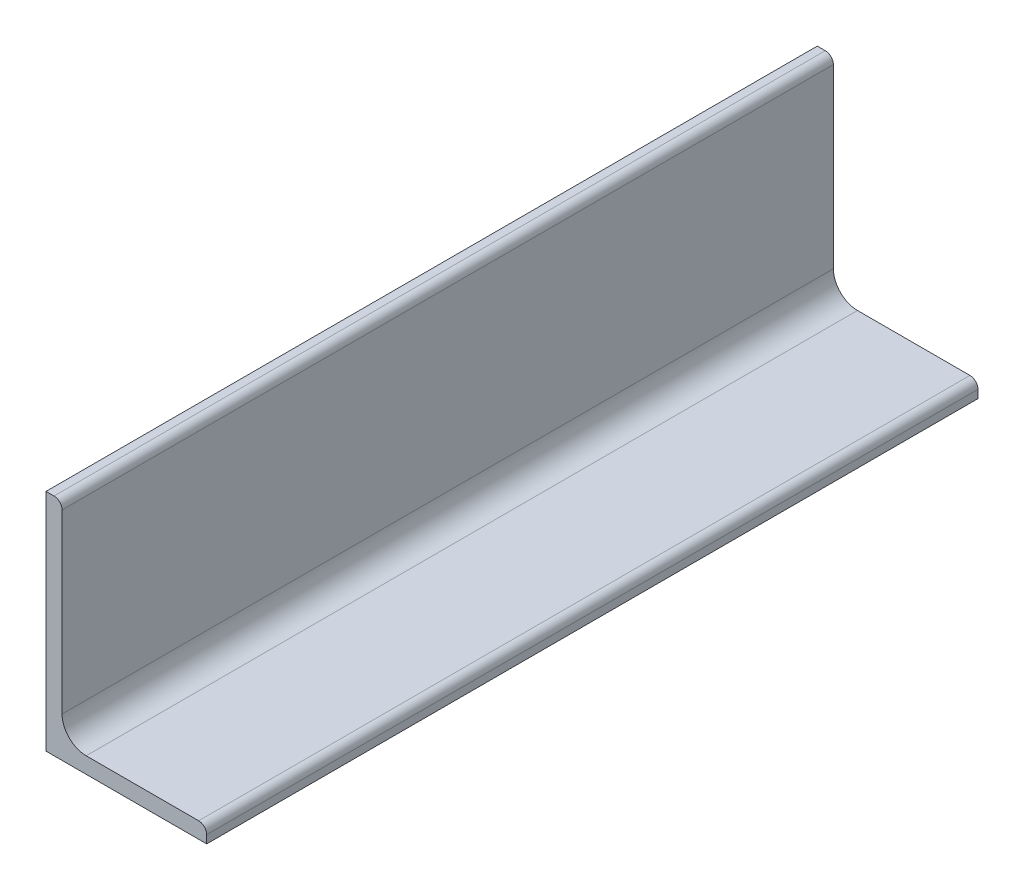
ISO-10303-21;
HEADER;
FILE_DESCRIPTION(('STEP AP214'),'2;1');
FILE_NAME('part.step','',(''),(''),'','','');
FILE_SCHEMA(('AUTOMOTIVE_DESIGN { 1 0 10303 214 1 1 1 1 }'));
ENDSEC;
DATA;
#1=APPLICATION_CONTEXT('core data for automotive mechanical design processes');
#2=APPLICATION_PROTOCOL_DEFINITION('international standard','automotive_design',2000,#1);
#3=PRODUCT_CONTEXT('',#1,'mechanical');
#4=PRODUCT('Part','Part','',(#3));
#5=PRODUCT_RELATED_PRODUCT_CATEGORY('part','',(#4));
#6=PRODUCT_DEFINITION_FORMATION('','',#4);
#7=PRODUCT_DEFINITION_CONTEXT('part definition',#1,'design');
#8=PRODUCT_DEFINITION('design','',#6,#7);
#9=PRODUCT_DEFINITION_SHAPE('','',#8);
#10=(LENGTH_UNIT() NAMED_UNIT(*) SI_UNIT(.MILLI.,.METRE.));
#11=(NAMED_UNIT(*) PLANE_ANGLE_UNIT() SI_UNIT($,.RADIAN.));
#12=(NAMED_UNIT(*) SI_UNIT($,.STERADIAN.) SOLID_ANGLE_UNIT());
#13=UNCERTAINTY_MEASURE_WITH_UNIT(LENGTH_MEASURE(1.E-05),#10,'distance_accuracy_value','');
#14=(GEOMETRIC_REPRESENTATION_CONTEXT(3) GLOBAL_UNCERTAINTY_ASSIGNED_CONTEXT((#13)) GLOBAL_UNIT_ASSIGNED_CONTEXT((#10,
#11,#12)) REPRESENTATION_CONTEXT('',''));
#15=CARTESIAN_POINT('',(0.,0.,0.));
#16=DIRECTION('',(0.,0.,1.));
#17=DIRECTION('',(1.,0.,0.));
#18=AXIS2_PLACEMENT_3D('',#15,#16,#17);
#19=CARTESIAN_POINT('',(0.897927251325018,89.7372005393545,304.8));
#20=DIRECTION('',(1.,0.,0.));
#21=DIRECTION('',(0.,0.,-1.));
#22=AXIS2_PLACEMENT_3D('',#19,#20,#21);
#23=PLANE('',#22);
#24=DIRECTION('',(0.,-1.,0.));
#25=VECTOR('',#24,1.);
#26=CARTESIAN_POINT('',(0.897927251325018,89.7372005393545,0.));
#27=LINE('',#26,#25);
#28=CARTESIAN_POINT('',(0.897927251325018,89.7372005393545,0.));
#29=VERTEX_POINT('',#28);
#30=CARTESIAN_POINT('',(0.897927251325018,0.837200539354535,0.));
#31=VERTEX_POINT('',#30);
#32=EDGE_CURVE('E135',#29,#31,#27,.T.);
#33=ORIENTED_EDGE('',*,*,#32,.T.);
#34=DIRECTION('',(0.,0.,-1.));
#35=VECTOR('',#34,1.);
#36=CARTESIAN_POINT('',(0.897927251325018,0.837200539354535,304.8));
#37=LINE('',#36,#35);
#38=CARTESIAN_POINT('',(0.897927251325018,0.837200539354535,304.8));
#39=VERTEX_POINT('',#38);
#40=EDGE_CURVE('E11',#39,#31,#37,.T.);
#41=ORIENTED_EDGE('',*,*,#40,.F.);
#42=DIRECTION('',(0.,-1.,0.));
#43=VECTOR('',#42,1.);
#44=CARTESIAN_POINT('',(0.897927251325018,89.7372005393545,304.8));
#45=LINE('',#44,#43);
#46=CARTESIAN_POINT('',(0.897927251325018,89.7372005393545,304.8));
#47=VERTEX_POINT('',#46);
#48=EDGE_CURVE('E151',#47,#39,#45,.T.);
#49=ORIENTED_EDGE('',*,*,#48,.F.);
#50=DIRECTION('',(0.,0.,-1.));
#51=VECTOR('',#50,1.);
#52=CARTESIAN_POINT('',(0.897927251325018,89.7372005393545,304.8));
#53=LINE('',#52,#51);
#54=EDGE_CURVE('E131',#47,#29,#53,.T.);
#55=ORIENTED_EDGE('',*,*,#54,.T.);
#56=EDGE_LOOP('',(#33,#41,#49,#55));
#57=FACE_BOUND('',#56,.T.);
#58=ADVANCED_FACE('F33',(#57),#23,.F.);
#59=CARTESIAN_POINT('',(0.897927251325018,0.837200539354535,304.8));
#60=DIRECTION('',(0.,1.,0.));
#61=DIRECTION('',(0.,0.,1.));
#62=AXIS2_PLACEMENT_3D('',#59,#60,#61);
#63=PLANE('',#62);
#64=DIRECTION('',(1.,0.,0.));
#65=VECTOR('',#64,1.);
#66=CARTESIAN_POINT('',(0.897927251325018,0.837200539354535,0.));
#67=LINE('',#66,#65);
#68=CARTESIAN_POINT('',(64.397927251325,0.837200539354535,0.));
#69=VERTEX_POINT('',#68);
#70=EDGE_CURVE('E138',#31,#69,#67,.T.);
#71=ORIENTED_EDGE('',*,*,#70,.T.);
#72=DIRECTION('',(0.,0.,-1.));
#73=VECTOR('',#72,1.);
#74=CARTESIAN_POINT('',(64.397927251325,0.837200539354535,304.8));
#75=LINE('',#74,#73);
#76=CARTESIAN_POINT('',(64.397927251325,0.837200539354535,304.8));
#77=VERTEX_POINT('',#76);
#78=EDGE_CURVE('E41',#77,#69,#75,.T.);
#79=ORIENTED_EDGE('',*,*,#78,.F.);
#80=DIRECTION('',(1.,0.,0.));
#81=VECTOR('',#80,1.);
#82=CARTESIAN_POINT('',(0.897927251325018,0.837200539354535,304.8));
#83=LINE('',#82,#81);
#84=EDGE_CURVE('E95',#39,#77,#83,.T.);
#85=ORIENTED_EDGE('',*,*,#84,.F.);
#86=ORIENTED_EDGE('',*,*,#40,.T.);
#87=EDGE_LOOP('',(#71,#79,#85,#86));
#88=FACE_BOUND('',#87,.T.);
#89=ADVANCED_FACE('F194',(#88),#63,.F.);
#90=CARTESIAN_POINT('',(64.397927251325,0.837200539354535,304.8));
#91=DIRECTION('',(-1.,0.,0.));
#92=DIRECTION('',(0.,0.,1.));
#93=AXIS2_PLACEMENT_3D('',#90,#91,#92);
#94=PLANE('',#93);
#95=DIRECTION('',(0.,1.,0.));
#96=VECTOR('',#95,1.);
#97=CARTESIAN_POINT('',(64.397927251325,0.837200539354535,0.));
#98=LINE('',#97,#96);
#99=CARTESIAN_POINT('',(64.397927251325,4.01220053935453,0.));
#100=VERTEX_POINT('',#99);
#101=EDGE_CURVE('E140',#69,#100,#98,.T.);
#102=ORIENTED_EDGE('',*,*,#101,.T.);
#103=DIRECTION('',(0.,0.,-1.));
#104=VECTOR('',#103,1.);
#105=CARTESIAN_POINT('',(64.397927251325,4.01220053935453,304.8));
#106=LINE('',#105,#104);
#107=CARTESIAN_POINT('',(64.397927251325,4.01220053935453,304.8));
#108=VERTEX_POINT('',#107);
#109=EDGE_CURVE('E161',#108,#100,#106,.T.);
#110=ORIENTED_EDGE('',*,*,#109,.F.);
#111=DIRECTION('',(0.,1.,0.));
#112=VECTOR('',#111,1.);
#113=CARTESIAN_POINT('',(64.397927251325,0.837200539354535,304.8));
#114=LINE('',#113,#112);
#115=EDGE_CURVE('E169',#77,#108,#114,.T.);
#116=ORIENTED_EDGE('',*,*,#115,.F.);
#117=ORIENTED_EDGE('',*,*,#78,.T.);
#118=EDGE_LOOP('',(#102,#110,#116,#117));
#119=FACE_BOUND('',#118,.T.);
#120=ADVANCED_FACE('F167',(#119),#94,.F.);
#121=CARTESIAN_POINT('',(61.222927251325,4.01220053935453,304.8));
#122=DIRECTION('',(0.,0.,-1.));
#123=DIRECTION('',(-1.,0.,0.));
#124=AXIS2_PLACEMENT_3D('',#121,#122,#123);
#125=CYLINDRICAL_SURFACE('',#124,3.175);
#126=CARTESIAN_POINT('',(61.222927251325,4.01220053935453,0.));
#127=DIRECTION('',(0.,0.,1.));
#128=DIRECTION('',(1.,0.,0.));
#129=AXIS2_PLACEMENT_3D('',#126,#127,#128);
#130=CIRCLE('',#129,3.175);
#131=CARTESIAN_POINT('',(61.222927251325,7.18720053935453,0.));
#132=VERTEX_POINT('',#131);
#133=EDGE_CURVE('E142',#100,#132,#130,.T.);
#134=ORIENTED_EDGE('',*,*,#133,.T.);
#135=DIRECTION('',(0.,0.,-1.));
#136=VECTOR('',#135,1.);
#137=CARTESIAN_POINT('',(61.222927251325,7.18720053935453,304.8));
#138=LINE('',#137,#136);
#139=CARTESIAN_POINT('',(61.222927251325,7.18720053935453,304.8));
#140=VERTEX_POINT('',#139);
#141=EDGE_CURVE('E158',#140,#132,#138,.T.);
#142=ORIENTED_EDGE('',*,*,#141,.F.);
#143=CARTESIAN_POINT('',(61.222927251325,4.01220053935453,304.8));
#144=DIRECTION('',(0.,0.,1.));
#145=DIRECTION('',(1.,0.,0.));
#146=AXIS2_PLACEMENT_3D('',#143,#144,#145);
#147=CIRCLE('',#146,3.175);
#148=EDGE_CURVE('E185',#108,#140,#147,.T.);
#149=ORIENTED_EDGE('',*,*,#148,.F.);
#150=ORIENTED_EDGE('',*,*,#109,.T.);
#151=EDGE_LOOP('',(#134,#142,#149,#150));
#152=FACE_BOUND('',#151,.T.);
#153=ADVANCED_FACE('F178',(#152),#125,.T.);
#154=CARTESIAN_POINT('',(61.222927251325,7.18720053935453,304.8));
#155=DIRECTION('',(0.,-1.,0.));
#156=DIRECTION('',(0.,0.,-1.));
#157=AXIS2_PLACEMENT_3D('',#154,#155,#156);
#158=PLANE('',#157);
#159=DIRECTION('',(-1.,0.,0.));
#160=VECTOR('',#159,1.);
#161=CARTESIAN_POINT('',(61.222927251325,7.18720053935453,0.));
#162=LINE('',#161,#160);
#163=CARTESIAN_POINT('',(16.772927251325,7.18720053935453,0.));
#164=VERTEX_POINT('',#163);
#165=EDGE_CURVE('E144',#132,#164,#162,.T.);
#166=ORIENTED_EDGE('',*,*,#165,.T.);
#167=DIRECTION('',(0.,0.,-1.));
#168=VECTOR('',#167,1.);
#169=CARTESIAN_POINT('',(16.772927251325,7.18720053935453,304.8));
#170=LINE('',#169,#168);
#171=CARTESIAN_POINT('',(16.772927251325,7.18720053935453,304.8));
#172=VERTEX_POINT('',#171);
#173=EDGE_CURVE('E155',#172,#164,#170,.T.);
#174=ORIENTED_EDGE('',*,*,#173,.F.);
#175=DIRECTION('',(-1.,0.,0.));
#176=VECTOR('',#175,1.);
#177=CARTESIAN_POINT('',(61.222927251325,7.18720053935453,304.8));
#178=LINE('',#177,#176);
#179=EDGE_CURVE('E184',#140,#172,#178,.T.);
#180=ORIENTED_EDGE('',*,*,#179,.F.);
#181=ORIENTED_EDGE('',*,*,#141,.T.);
#182=EDGE_LOOP('',(#166,#174,#180,#181));
#183=FACE_BOUND('',#182,.T.);
#184=ADVANCED_FACE('F182',(#183),#158,.F.);
#185=CARTESIAN_POINT('',(16.772927251325,16.7122005393545,304.8));
#186=DIRECTION('',(0.,0.,-1.));
#187=DIRECTION('',(-1.,0.,0.));
#188=AXIS2_PLACEMENT_3D('',#185,#186,#187);
#189=CYLINDRICAL_SURFACE('',#188,9.52499999999999);
#190=CARTESIAN_POINT('',(16.772927251325,16.7122005393545,0.));
#191=DIRECTION('',(0.,0.,-1.));
#192=DIRECTION('',(1.,0.,0.));
#193=AXIS2_PLACEMENT_3D('',#190,#191,#192);
#194=CIRCLE('',#193,9.52499999999999);
#195=CARTESIAN_POINT('',(7.24792725132502,16.7122005393545,0.));
#196=VERTEX_POINT('',#195);
#197=EDGE_CURVE('E146',#164,#196,#194,.T.);
#198=ORIENTED_EDGE('',*,*,#197,.T.);
#199=DIRECTION('',(0.,0.,-1.));
#200=VECTOR('',#199,1.);
#201=CARTESIAN_POINT('',(7.24792725132502,16.7122005393545,304.8));
#202=LINE('',#201,#200);
#203=CARTESIAN_POINT('',(7.24792725132502,16.7122005393545,304.8));
#204=VERTEX_POINT('',#203);
#205=EDGE_CURVE('E126',#204,#196,#202,.T.);
#206=ORIENTED_EDGE('',*,*,#205,.F.);
#207=CARTESIAN_POINT('',(16.772927251325,16.7122005393545,304.8));
#208=DIRECTION('',(0.,0.,-1.));
#209=DIRECTION('',(1.,0.,0.));
#210=AXIS2_PLACEMENT_3D('',#207,#208,#209);
#211=CIRCLE('',#210,9.52499999999999);
#212=EDGE_CURVE('E117',#172,#204,#211,.T.);
#213=ORIENTED_EDGE('',*,*,#212,.F.);
#214=ORIENTED_EDGE('',*,*,#173,.T.);
#215=EDGE_LOOP('',(#198,#206,#213,#214));
#216=FACE_BOUND('',#215,.T.);
#217=ADVANCED_FACE('F206',(#216),#189,.F.);
#218=CARTESIAN_POINT('',(7.24792725132502,16.7122005393545,304.8));
#219=DIRECTION('',(-1.,0.,0.));
#220=DIRECTION('',(0.,0.,1.));
#221=AXIS2_PLACEMENT_3D('',#218,#219,#220);
#222=PLANE('',#221);
#223=DIRECTION('',(0.,1.,0.));
#224=VECTOR('',#223,1.);
#225=CARTESIAN_POINT('',(7.24792725132502,16.7122005393545,0.));
#226=LINE('',#225,#224);
#227=CARTESIAN_POINT('',(7.24792725132502,86.5622005393545,0.));
#228=VERTEX_POINT('',#227);
#229=EDGE_CURVE('E125',#196,#228,#226,.T.);
#230=ORIENTED_EDGE('',*,*,#229,.T.);
#231=DIRECTION('',(0.,0.,-1.));
#232=VECTOR('',#231,1.);
#233=CARTESIAN_POINT('',(7.24792725132502,86.5622005393545,304.8));
#234=LINE('',#233,#232);
#235=CARTESIAN_POINT('',(7.24792725132502,86.5622005393545,304.8));
#236=VERTEX_POINT('',#235);
#237=EDGE_CURVE('E122',#236,#228,#234,.T.);
#238=ORIENTED_EDGE('',*,*,#237,.F.);
#239=DIRECTION('',(0.,1.,0.));
#240=VECTOR('',#239,1.);
#241=CARTESIAN_POINT('',(7.24792725132502,16.7122005393545,304.8));
#242=LINE('',#241,#240);
#243=EDGE_CURVE('E111',#204,#236,#242,.T.);
#244=ORIENTED_EDGE('',*,*,#243,.F.);
#245=ORIENTED_EDGE('',*,*,#205,.T.);
#246=EDGE_LOOP('',(#230,#238,#244,#245));
#247=FACE_BOUND('',#246,.T.);
#248=ADVANCED_FACE('F123',(#247),#222,.F.);
#249=CARTESIAN_POINT('',(4.07292725132502,86.5622005393545,304.8));
#250=DIRECTION('',(0.,0.,-1.));
#251=DIRECTION('',(-1.,0.,0.));
#252=AXIS2_PLACEMENT_3D('',#249,#250,#251);
#253=CYLINDRICAL_SURFACE('',#252,3.17500000000001);
#254=CARTESIAN_POINT('',(4.07292725132502,86.5622005393545,0.));
#255=DIRECTION('',(0.,0.,1.));
#256=DIRECTION('',(1.,0.,0.));
#257=AXIS2_PLACEMENT_3D('',#254,#255,#256);
#258=CIRCLE('',#257,3.17500000000001);
#259=CARTESIAN_POINT('',(4.07292725132502,89.7372005393545,0.));
#260=VERTEX_POINT('',#259);
#261=EDGE_CURVE('E81',#228,#260,#258,.T.);
#262=ORIENTED_EDGE('',*,*,#261,.T.);
#263=DIRECTION('',(0.,0.,-1.));
#264=VECTOR('',#263,1.);
#265=CARTESIAN_POINT('',(4.07292725132502,89.7372005393545,304.8));
#266=LINE('',#265,#264);
#267=CARTESIAN_POINT('',(4.07292725132502,89.7372005393545,304.8));
#268=VERTEX_POINT('',#267);
#269=EDGE_CURVE('E127',#268,#260,#266,.T.);
#270=ORIENTED_EDGE('',*,*,#269,.F.);
#271=CARTESIAN_POINT('',(4.07292725132502,86.5622005393545,304.8));
#272=DIRECTION('',(0.,0.,1.));
#273=DIRECTION('',(1.,0.,0.));
#274=AXIS2_PLACEMENT_3D('',#271,#272,#273);
#275=CIRCLE('',#274,3.17500000000001);
#276=EDGE_CURVE('E115',#236,#268,#275,.T.);
#277=ORIENTED_EDGE('',*,*,#276,.F.);
#278=ORIENTED_EDGE('',*,*,#237,.T.);
#279=EDGE_LOOP('',(#262,#270,#277,#278));
#280=FACE_BOUND('',#279,.T.);
#281=ADVANCED_FACE('F129',(#280),#253,.T.);
#282=CARTESIAN_POINT('',(4.07292725132502,89.7372005393545,304.8));
#283=DIRECTION('',(0.,-1.,0.));
#284=DIRECTION('',(0.,0.,-1.));
#285=AXIS2_PLACEMENT_3D('',#282,#283,#284);
#286=PLANE('',#285);
#287=DIRECTION('',(-1.,0.,0.));
#288=VECTOR('',#287,1.);
#289=CARTESIAN_POINT('',(4.07292725132502,89.7372005393545,0.));
#290=LINE('',#289,#288);
#291=EDGE_CURVE('E87',#260,#29,#290,.T.);
#292=ORIENTED_EDGE('',*,*,#291,.T.);
#293=ORIENTED_EDGE('',*,*,#54,.F.);
#294=DIRECTION('',(-1.,0.,0.));
#295=VECTOR('',#294,1.);
#296=CARTESIAN_POINT('',(4.07292725132502,89.7372005393545,304.8));
#297=LINE('',#296,#295);
#298=EDGE_CURVE('E49',#268,#47,#297,.T.);
#299=ORIENTED_EDGE('',*,*,#298,.F.);
#300=ORIENTED_EDGE('',*,*,#269,.T.);
#301=EDGE_LOOP('',(#292,#293,#299,#300));
#302=FACE_BOUND('',#301,.T.);
#303=ADVANCED_FACE('F214',(#302),#286,.F.);
#304=CARTESIAN_POINT('',(61.222927251325,4.01220053935453,304.8));
#305=DIRECTION('',(0.,0.,1.));
#306=DIRECTION('',(1.,0.,0.));
#307=AXIS2_PLACEMENT_3D('',#304,#305,#306);
#308=PLANE('',#307);
#309=ORIENTED_EDGE('',*,*,#48,.T.);
#310=ORIENTED_EDGE('',*,*,#84,.T.);
#311=ORIENTED_EDGE('',*,*,#115,.T.);
#312=ORIENTED_EDGE('',*,*,#148,.T.);
#313=ORIENTED_EDGE('',*,*,#179,.T.);
#314=ORIENTED_EDGE('',*,*,#212,.T.);
#315=ORIENTED_EDGE('',*,*,#243,.T.);
#316=ORIENTED_EDGE('',*,*,#276,.T.);
#317=ORIENTED_EDGE('',*,*,#298,.T.);
#318=EDGE_LOOP('',(#309,#310,#311,#312,#313,#314,#315,#316,#317));
#319=FACE_BOUND('',#318,.T.);
#320=ADVANCED_FACE('F113',(#319),#308,.T.);
#321=CARTESIAN_POINT('',(61.222927251325,4.01220053935453,0.));
#322=DIRECTION('',(0.,0.,1.));
#323=DIRECTION('',(1.,0.,0.));
#324=AXIS2_PLACEMENT_3D('',#321,#322,#323);
#325=PLANE('',#324);
#326=ORIENTED_EDGE('',*,*,#32,.F.);
#327=ORIENTED_EDGE('',*,*,#291,.F.);
#328=ORIENTED_EDGE('',*,*,#261,.F.);
#329=ORIENTED_EDGE('',*,*,#229,.F.);
#330=ORIENTED_EDGE('',*,*,#197,.F.);
#331=ORIENTED_EDGE('',*,*,#165,.F.);
#332=ORIENTED_EDGE('',*,*,#133,.F.);
#333=ORIENTED_EDGE('',*,*,#101,.F.);
#334=ORIENTED_EDGE('',*,*,#70,.F.);
#335=EDGE_LOOP('',(#326,#327,#328,#329,#330,#331,#332,#333,#334));
#336=FACE_BOUND('',#335,.T.);
#337=ADVANCED_FACE('F173',(#336),#325,.F.);
#338=CLOSED_SHELL('',(#58,#89,#120,#153,#184,#217,#248,#281,#303,#320,#337));
#339=MANIFOLD_SOLID_BREP('B2',#338);
#340=ADVANCED_BREP_SHAPE_REPRESENTATION('',(#18,#339),#14);
#341=SHAPE_DEFINITION_REPRESENTATION(#9,#340);
ENDSEC;
END-ISO-10303-21;
